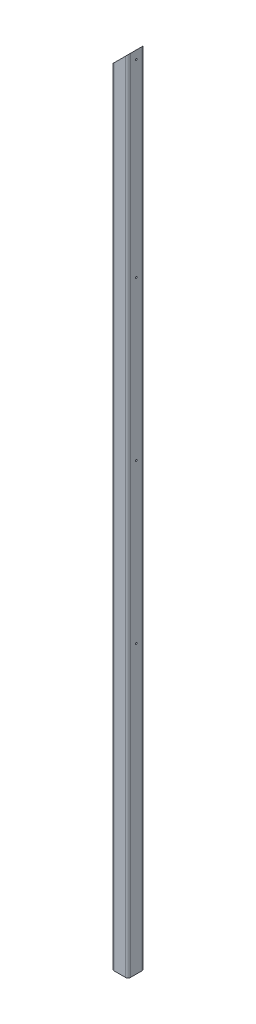
ISO-10303-21;
HEADER;
FILE_DESCRIPTION(('STEP AP214'),'2;1');
FILE_NAME('part.step','',(''),(''),'','','');
FILE_SCHEMA(('AUTOMOTIVE_DESIGN { 1 0 10303 214 1 1 1 1 }'));
ENDSEC;
DATA;
#1=APPLICATION_CONTEXT('core data for automotive mechanical design processes');
#2=APPLICATION_PROTOCOL_DEFINITION('international standard','automotive_design',2000,#1);
#3=PRODUCT_CONTEXT('',#1,'mechanical');
#4=PRODUCT('Part','Part','',(#3));
#5=PRODUCT_RELATED_PRODUCT_CATEGORY('part','',(#4));
#6=PRODUCT_DEFINITION_FORMATION('','',#4);
#7=PRODUCT_DEFINITION_CONTEXT('part definition',#1,'design');
#8=PRODUCT_DEFINITION('design','',#6,#7);
#9=PRODUCT_DEFINITION_SHAPE('','',#8);
#10=(LENGTH_UNIT() NAMED_UNIT(*) SI_UNIT(.MILLI.,.METRE.));
#11=(NAMED_UNIT(*) PLANE_ANGLE_UNIT() SI_UNIT($,.RADIAN.));
#12=(NAMED_UNIT(*) SI_UNIT($,.STERADIAN.) SOLID_ANGLE_UNIT());
#13=UNCERTAINTY_MEASURE_WITH_UNIT(LENGTH_MEASURE(1.E-05),#10,'distance_accuracy_value','');
#14=(GEOMETRIC_REPRESENTATION_CONTEXT(3) GLOBAL_UNCERTAINTY_ASSIGNED_CONTEXT((#13)) GLOBAL_UNIT_ASSIGNED_CONTEXT((#10,
#11,#12)) REPRESENTATION_CONTEXT('',''));
#15=CARTESIAN_POINT('',(0.,0.,0.));
#16=DIRECTION('',(0.,0.,1.));
#17=DIRECTION('',(1.,0.,0.));
#18=AXIS2_PLACEMENT_3D('',#15,#16,#17);
#19=CARTESIAN_POINT('',(-13.6,1920.,13.6));
#20=DIRECTION('',(0.,-1.,0.));
#21=DIRECTION('',(0.,0.,-1.));
#22=AXIS2_PLACEMENT_3D('',#19,#20,#21);
#23=CYLINDRICAL_SURFACE('',#22,6.4);
#24=CARTESIAN_POINT('',(-13.6,1886.4,13.6));
#25=DIRECTION('',(-0.707106781186548,0.707106781186547,0.));
#26=DIRECTION('',(-0.707106781186547,-0.707106781186548,0.));
#27=AXIS2_PLACEMENT_3D('',#24,#25,#26);
#28=ELLIPSE('',#27,9.05096679918782,6.4);
#29=CARTESIAN_POINT('',(-20.,1880.,13.6));
#30=VERTEX_POINT('',#29);
#31=CARTESIAN_POINT('',(-13.5999999999999,1886.4,20.));
#32=VERTEX_POINT('',#31);
#33=EDGE_CURVE('E245',#30,#32,#28,.T.);
#34=ORIENTED_EDGE('',*,*,#33,.F.);
#35=DIRECTION('',(0.,-1.,0.));
#36=VECTOR('',#35,1.);
#37=CARTESIAN_POINT('',(-20.,1920.,13.6));
#38=LINE('',#37,#36);
#39=CARTESIAN_POINT('',(-20.,0.,13.6));
#40=VERTEX_POINT('',#39);
#41=EDGE_CURVE('E161',#30,#40,#38,.T.);
#42=ORIENTED_EDGE('',*,*,#41,.T.);
#43=CARTESIAN_POINT('',(-13.6,0.,13.6));
#44=DIRECTION('',(0.,1.,0.));
#45=DIRECTION('',(0.,0.,1.));
#46=AXIS2_PLACEMENT_3D('',#43,#44,#45);
#47=CIRCLE('',#46,6.4);
#48=CARTESIAN_POINT('',(-13.6,0.,20.));
#49=VERTEX_POINT('',#48);
#50=EDGE_CURVE('E176',#40,#49,#47,.T.);
#51=ORIENTED_EDGE('',*,*,#50,.T.);
#52=DIRECTION('',(0.,-1.,0.));
#53=VECTOR('',#52,1.);
#54=CARTESIAN_POINT('',(-13.6,1920.,20.));
#55=LINE('',#54,#53);
#56=EDGE_CURVE('E12',#32,#49,#55,.T.);
#57=ORIENTED_EDGE('',*,*,#56,.F.);
#58=EDGE_LOOP('',(#34,#42,#51,#57));
#59=FACE_BOUND('',#58,.T.);
#60=ADVANCED_FACE('F66',(#59),#23,.T.);
#61=CARTESIAN_POINT('',(-13.6,1920.,20.));
#62=DIRECTION('',(0.,0.,-1.));
#63=DIRECTION('',(-1.,0.,0.));
#64=AXIS2_PLACEMENT_3D('',#61,#62,#63);
#65=PLANE('',#64);
#66=DIRECTION('',(0.707106781186547,0.707106781186548,0.));
#67=VECTOR('',#66,1.);
#68=CARTESIAN_POINT('',(-950.,950.,20.));
#69=LINE('',#68,#67);
#70=CARTESIAN_POINT('',(13.6,1913.6,20.));
#71=VERTEX_POINT('',#70);
#72=EDGE_CURVE('E350',#32,#71,#69,.T.);
#73=ORIENTED_EDGE('',*,*,#72,.F.);
#74=ORIENTED_EDGE('',*,*,#56,.T.);
#75=DIRECTION('',(1.,0.,0.));
#76=VECTOR('',#75,1.);
#77=CARTESIAN_POINT('',(-13.6,0.,20.));
#78=LINE('',#77,#76);
#79=CARTESIAN_POINT('',(13.6,0.,20.));
#80=VERTEX_POINT('',#79);
#81=EDGE_CURVE('E274',#49,#80,#78,.T.);
#82=ORIENTED_EDGE('',*,*,#81,.T.);
#83=DIRECTION('',(0.,-1.,0.));
#84=VECTOR('',#83,1.);
#85=CARTESIAN_POINT('',(13.6,1920.,20.));
#86=LINE('',#85,#84);
#87=EDGE_CURVE('E76',#71,#80,#86,.T.);
#88=ORIENTED_EDGE('',*,*,#87,.F.);
#89=EDGE_LOOP('',(#73,#74,#82,#88));
#90=FACE_BOUND('',#89,.T.);
#91=ADVANCED_FACE('F356',(#90),#65,.F.);
#92=CARTESIAN_POINT('',(13.6,1920.,13.6));
#93=DIRECTION('',(0.,-1.,0.));
#94=DIRECTION('',(0.,0.,-1.));
#95=AXIS2_PLACEMENT_3D('',#92,#93,#94);
#96=CYLINDRICAL_SURFACE('',#95,6.4);
#97=CARTESIAN_POINT('',(13.6,1913.6,13.6));
#98=DIRECTION('',(-0.707106781186548,0.707106781186547,0.));
#99=DIRECTION('',(-0.707106781186547,-0.707106781186548,0.));
#100=AXIS2_PLACEMENT_3D('',#97,#98,#99);
#101=ELLIPSE('',#100,9.05096679918782,6.4);
#102=CARTESIAN_POINT('',(20.,1920.,13.6));
#103=VERTEX_POINT('',#102);
#104=EDGE_CURVE('E93',#71,#103,#101,.T.);
#105=ORIENTED_EDGE('',*,*,#104,.F.);
#106=ORIENTED_EDGE('',*,*,#87,.T.);
#107=CARTESIAN_POINT('',(13.6,0.,13.6));
#108=DIRECTION('',(0.,1.,0.));
#109=DIRECTION('',(0.,0.,1.));
#110=AXIS2_PLACEMENT_3D('',#107,#108,#109);
#111=CIRCLE('',#110,6.4);
#112=CARTESIAN_POINT('',(20.,0.,13.6));
#113=VERTEX_POINT('',#112);
#114=EDGE_CURVE('E278',#80,#113,#111,.T.);
#115=ORIENTED_EDGE('',*,*,#114,.T.);
#116=DIRECTION('',(0.,-1.,0.));
#117=VECTOR('',#116,1.);
#118=CARTESIAN_POINT('',(20.,1920.,13.6));
#119=LINE('',#118,#117);
#120=EDGE_CURVE('E196',#103,#113,#119,.T.);
#121=ORIENTED_EDGE('',*,*,#120,.F.);
#122=EDGE_LOOP('',(#105,#106,#115,#121));
#123=FACE_BOUND('',#122,.T.);
#124=ADVANCED_FACE('F424',(#123),#96,.T.);
#125=CARTESIAN_POINT('',(13.6,1920.,-13.6));
#126=DIRECTION('',(0.,-1.,0.));
#127=DIRECTION('',(0.,0.,-1.));
#128=AXIS2_PLACEMENT_3D('',#125,#126,#127);
#129=CYLINDRICAL_SURFACE('',#128,6.4);
#130=CARTESIAN_POINT('',(13.6,1913.6,-13.6));
#131=DIRECTION('',(-0.707106781186548,0.707106781186547,0.));
#132=DIRECTION('',(-0.707106781186547,-0.707106781186548,0.));
#133=AXIS2_PLACEMENT_3D('',#130,#131,#132);
#134=ELLIPSE('',#133,9.05096679918781,6.4);
#135=CARTESIAN_POINT('',(20.,1920.,-13.6));
#136=VERTEX_POINT('',#135);
#137=CARTESIAN_POINT('',(13.6000000000003,1913.6,-20.));
#138=VERTEX_POINT('',#137);
#139=EDGE_CURVE('E303',#136,#138,#134,.T.);
#140=ORIENTED_EDGE('',*,*,#139,.F.);
#141=DIRECTION('',(0.,-1.,0.));
#142=VECTOR('',#141,1.);
#143=CARTESIAN_POINT('',(20.,1920.,-13.6));
#144=LINE('',#143,#142);
#145=CARTESIAN_POINT('',(20.,0.,-13.6));
#146=VERTEX_POINT('',#145);
#147=EDGE_CURVE('E192',#136,#146,#144,.T.);
#148=ORIENTED_EDGE('',*,*,#147,.T.);
#149=CARTESIAN_POINT('',(13.6,0.,-13.6));
#150=DIRECTION('',(0.,1.,0.));
#151=DIRECTION('',(0.,0.,1.));
#152=AXIS2_PLACEMENT_3D('',#149,#150,#151);
#153=CIRCLE('',#152,6.4);
#154=CARTESIAN_POINT('',(13.6,0.,-20.));
#155=VERTEX_POINT('',#154);
#156=EDGE_CURVE('E284',#146,#155,#153,.T.);
#157=ORIENTED_EDGE('',*,*,#156,.T.);
#158=DIRECTION('',(0.,-1.,0.));
#159=VECTOR('',#158,1.);
#160=CARTESIAN_POINT('',(13.6,1920.,-20.));
#161=LINE('',#160,#159);
#162=EDGE_CURVE('E189',#138,#155,#161,.T.);
#163=ORIENTED_EDGE('',*,*,#162,.F.);
#164=EDGE_LOOP('',(#140,#148,#157,#163));
#165=FACE_BOUND('',#164,.T.);
#166=ADVANCED_FACE('F298',(#165),#129,.T.);
#167=CARTESIAN_POINT('',(13.6,1920.,-20.));
#168=DIRECTION('',(0.,0.,1.));
#169=DIRECTION('',(1.,0.,0.));
#170=AXIS2_PLACEMENT_3D('',#167,#168,#169);
#171=PLANE('',#170);
#172=CARTESIAN_POINT('',(0.,687.,-20.));
#173=DIRECTION('',(0.,0.,-1.));
#174=DIRECTION('',(-1.,0.,0.));
#175=AXIS2_PLACEMENT_3D('',#172,#173,#174);
#176=CIRCLE('',#175,2.);
#177=CARTESIAN_POINT('',(-2.,687.,-20.));
#178=VERTEX_POINT('',#177);
#179=EDGE_CURVE('E498',#178,#178,#176,.T.);
#180=ORIENTED_EDGE('',*,*,#179,.F.);
#181=EDGE_LOOP('',(#180));
#182=FACE_BOUND('',#181,.T.);
#183=CARTESIAN_POINT('',(0.,937.,-20.));
#184=DIRECTION('',(0.,0.,-1.));
#185=DIRECTION('',(-1.,0.,0.));
#186=AXIS2_PLACEMENT_3D('',#183,#184,#185);
#187=CIRCLE('',#186,2.);
#188=CARTESIAN_POINT('',(-1.99999999999991,937.,-20.));
#189=VERTEX_POINT('',#188);
#190=EDGE_CURVE('E505',#189,#189,#187,.T.);
#191=ORIENTED_EDGE('',*,*,#190,.F.);
#192=EDGE_LOOP('',(#191));
#193=FACE_BOUND('',#192,.T.);
#194=DIRECTION('',(0.707106781186547,0.707106781186548,0.));
#195=VECTOR('',#194,1.);
#196=CARTESIAN_POINT('',(-950.,950.,-20.));
#197=LINE('',#196,#195);
#198=CARTESIAN_POINT('',(-13.6,1886.4,-20.));
#199=VERTEX_POINT('',#198);
#200=EDGE_CURVE('E358',#199,#138,#197,.T.);
#201=ORIENTED_EDGE('',*,*,#200,.T.);
#202=ORIENTED_EDGE('',*,*,#162,.T.);
#203=DIRECTION('',(-1.,0.,0.));
#204=VECTOR('',#203,1.);
#205=CARTESIAN_POINT('',(13.6,0.,-20.));
#206=LINE('',#205,#204);
#207=CARTESIAN_POINT('',(-13.6,0.,-20.));
#208=VERTEX_POINT('',#207);
#209=EDGE_CURVE('E171',#155,#208,#206,.T.);
#210=ORIENTED_EDGE('',*,*,#209,.T.);
#211=DIRECTION('',(0.,-1.,0.));
#212=VECTOR('',#211,1.);
#213=CARTESIAN_POINT('',(-13.6,1920.,-20.));
#214=LINE('',#213,#212);
#215=EDGE_CURVE('E160',#199,#208,#214,.T.);
#216=ORIENTED_EDGE('',*,*,#215,.F.);
#217=EDGE_LOOP('',(#201,#202,#210,#216));
#218=FACE_BOUND('',#217,.T.);
#219=ADVANCED_FACE('F290',(#182,#193,#218),#171,.F.);
#220=CARTESIAN_POINT('',(-13.6,1920.,-13.6));
#221=DIRECTION('',(0.,-1.,0.));
#222=DIRECTION('',(0.,0.,-1.));
#223=AXIS2_PLACEMENT_3D('',#220,#221,#222);
#224=CYLINDRICAL_SURFACE('',#223,6.4);
#225=CARTESIAN_POINT('',(-13.6,1886.4,-13.6));
#226=DIRECTION('',(-0.707106781186548,0.707106781186547,0.));
#227=DIRECTION('',(-0.707106781186547,-0.707106781186548,0.));
#228=AXIS2_PLACEMENT_3D('',#225,#226,#227);
#229=ELLIPSE('',#228,9.05096679918782,6.4);
#230=CARTESIAN_POINT('',(-20.,1880.,-13.6));
#231=VERTEX_POINT('',#230);
#232=EDGE_CURVE('E331',#199,#231,#229,.T.);
#233=ORIENTED_EDGE('',*,*,#232,.F.);
#234=ORIENTED_EDGE('',*,*,#215,.T.);
#235=CARTESIAN_POINT('',(-13.6,0.,-13.6));
#236=DIRECTION('',(0.,1.,0.));
#237=DIRECTION('',(0.,0.,1.));
#238=AXIS2_PLACEMENT_3D('',#235,#236,#237);
#239=CIRCLE('',#238,6.4);
#240=CARTESIAN_POINT('',(-20.,0.,-13.6));
#241=VERTEX_POINT('',#240);
#242=EDGE_CURVE('E164',#208,#241,#239,.T.);
#243=ORIENTED_EDGE('',*,*,#242,.T.);
#244=DIRECTION('',(0.,-1.,0.));
#245=VECTOR('',#244,1.);
#246=CARTESIAN_POINT('',(-20.,1920.,-13.6));
#247=LINE('',#246,#245);
#248=EDGE_CURVE('E147',#231,#241,#247,.T.);
#249=ORIENTED_EDGE('',*,*,#248,.F.);
#250=EDGE_LOOP('',(#233,#234,#243,#249));
#251=FACE_BOUND('',#250,.T.);
#252=ADVANCED_FACE('F165',(#251),#224,.T.);
#253=CARTESIAN_POINT('',(13.6,1920.,13.6));
#254=DIRECTION('',(0.,-1.,0.));
#255=DIRECTION('',(0.,0.,-1.));
#256=AXIS2_PLACEMENT_3D('',#253,#254,#255);
#257=CYLINDRICAL_SURFACE('',#256,3.2);
#258=DIRECTION('',(0.,-1.,0.));
#259=VECTOR('',#258,1.);
#260=CARTESIAN_POINT('',(13.6,1920.,16.8));
#261=LINE('',#260,#259);
#262=CARTESIAN_POINT('',(13.6,1913.6,16.8));
#263=VERTEX_POINT('',#262);
#264=CARTESIAN_POINT('',(13.6,0.,16.8));
#265=VERTEX_POINT('',#264);
#266=EDGE_CURVE('E70',#263,#265,#261,.T.);
#267=ORIENTED_EDGE('',*,*,#266,.F.);
#268=CARTESIAN_POINT('',(13.6,1913.6,13.6));
#269=DIRECTION('',(-0.707106781186548,0.707106781186547,0.));
#270=DIRECTION('',(-0.707106781186547,-0.707106781186548,0.));
#271=AXIS2_PLACEMENT_3D('',#268,#269,#270);
#272=ELLIPSE('',#271,4.52548339959391,3.2);
#273=CARTESIAN_POINT('',(16.8,1916.8,13.6));
#274=VERTEX_POINT('',#273);
#275=EDGE_CURVE('E327',#263,#274,#272,.T.);
#276=ORIENTED_EDGE('',*,*,#275,.T.);
#277=DIRECTION('',(0.,-1.,0.));
#278=VECTOR('',#277,1.);
#279=CARTESIAN_POINT('',(16.8,1920.,13.6));
#280=LINE('',#279,#278);
#281=CARTESIAN_POINT('',(16.8,0.,13.6));
#282=VERTEX_POINT('',#281);
#283=EDGE_CURVE('E181',#274,#282,#280,.T.);
#284=ORIENTED_EDGE('',*,*,#283,.T.);
#285=CARTESIAN_POINT('',(13.6,0.,13.6));
#286=DIRECTION('',(0.,1.,0.));
#287=DIRECTION('',(0.,0.,1.));
#288=AXIS2_PLACEMENT_3D('',#285,#286,#287);
#289=CIRCLE('',#288,3.2);
#290=EDGE_CURVE('E239',#265,#282,#289,.T.);
#291=ORIENTED_EDGE('',*,*,#290,.F.);
#292=EDGE_LOOP('',(#267,#276,#284,#291));
#293=FACE_BOUND('',#292,.T.);
#294=ADVANCED_FACE('F68',(#293),#257,.F.);
#295=CARTESIAN_POINT('',(-13.6,1920.,16.8));
#296=DIRECTION('',(0.,0.,-1.));
#297=DIRECTION('',(-1.,0.,0.));
#298=AXIS2_PLACEMENT_3D('',#295,#296,#297);
#299=PLANE('',#298);
#300=DIRECTION('',(0.,-1.,0.));
#301=VECTOR('',#300,1.);
#302=CARTESIAN_POINT('',(-13.6,1920.,16.8));
#303=LINE('',#302,#301);
#304=CARTESIAN_POINT('',(-13.6,1886.4,16.8));
#305=VERTEX_POINT('',#304);
#306=CARTESIAN_POINT('',(-13.6,0.,16.8));
#307=VERTEX_POINT('',#306);
#308=EDGE_CURVE('E218',#305,#307,#303,.T.);
#309=ORIENTED_EDGE('',*,*,#308,.F.);
#310=DIRECTION('',(0.707106781186547,0.707106781186548,0.));
#311=VECTOR('',#310,1.);
#312=CARTESIAN_POINT('',(3.19999999999985,1903.2,16.8));
#313=LINE('',#312,#311);
#314=EDGE_CURVE('E235',#305,#263,#313,.T.);
#315=ORIENTED_EDGE('',*,*,#314,.T.);
#316=ORIENTED_EDGE('',*,*,#266,.T.);
#317=DIRECTION('',(1.,0.,0.));
#318=VECTOR('',#317,1.);
#319=CARTESIAN_POINT('',(-13.6,0.,16.8));
#320=LINE('',#319,#318);
#321=EDGE_CURVE('E232',#307,#265,#320,.T.);
#322=ORIENTED_EDGE('',*,*,#321,.F.);
#323=EDGE_LOOP('',(#309,#315,#316,#322));
#324=FACE_BOUND('',#323,.T.);
#325=ADVANCED_FACE('F230',(#324),#299,.T.);
#326=CARTESIAN_POINT('',(-13.6,1920.,13.6));
#327=DIRECTION('',(0.,-1.,0.));
#328=DIRECTION('',(0.,0.,-1.));
#329=AXIS2_PLACEMENT_3D('',#326,#327,#328);
#330=CYLINDRICAL_SURFACE('',#329,3.2);
#331=DIRECTION('',(0.,-1.,0.));
#332=VECTOR('',#331,1.);
#333=CARTESIAN_POINT('',(-16.8,1920.,13.6));
#334=LINE('',#333,#332);
#335=CARTESIAN_POINT('',(-16.8,1883.2,13.6));
#336=VERTEX_POINT('',#335);
#337=CARTESIAN_POINT('',(-16.8,0.,13.6));
#338=VERTEX_POINT('',#337);
#339=EDGE_CURVE('E216',#336,#338,#334,.T.);
#340=ORIENTED_EDGE('',*,*,#339,.F.);
#341=CARTESIAN_POINT('',(-13.6,1886.4,13.6));
#342=DIRECTION('',(-0.707106781186548,0.707106781186547,0.));
#343=DIRECTION('',(-0.707106781186547,-0.707106781186548,0.));
#344=AXIS2_PLACEMENT_3D('',#341,#342,#343);
#345=ELLIPSE('',#344,4.5254833995939,3.2);
#346=EDGE_CURVE('E336',#336,#305,#345,.T.);
#347=ORIENTED_EDGE('',*,*,#346,.T.);
#348=ORIENTED_EDGE('',*,*,#308,.T.);
#349=CARTESIAN_POINT('',(-13.6,0.,13.6));
#350=DIRECTION('',(0.,1.,0.));
#351=DIRECTION('',(0.,0.,1.));
#352=AXIS2_PLACEMENT_3D('',#349,#350,#351);
#353=CIRCLE('',#352,3.2);
#354=EDGE_CURVE('E248',#338,#307,#353,.T.);
#355=ORIENTED_EDGE('',*,*,#354,.F.);
#356=EDGE_LOOP('',(#340,#347,#348,#355));
#357=FACE_BOUND('',#356,.T.);
#358=ADVANCED_FACE('F392',(#357),#330,.F.);
#359=CARTESIAN_POINT('',(-16.8,1920.,13.6));
#360=DIRECTION('',(1.,0.,0.));
#361=DIRECTION('',(0.,0.,-1.));
#362=AXIS2_PLACEMENT_3D('',#359,#360,#361);
#363=PLANE('',#362);
#364=DIRECTION('',(0.,-1.,0.));
#365=VECTOR('',#364,1.);
#366=CARTESIAN_POINT('',(-16.8,1920.,-13.6));
#367=LINE('',#366,#365);
#368=CARTESIAN_POINT('',(-16.8,1883.2,-13.6));
#369=VERTEX_POINT('',#368);
#370=CARTESIAN_POINT('',(-16.8,0.,-13.6));
#371=VERTEX_POINT('',#370);
#372=EDGE_CURVE('E213',#369,#371,#367,.T.);
#373=ORIENTED_EDGE('',*,*,#372,.F.);
#374=DIRECTION('',(0.,0.,1.));
#375=VECTOR('',#374,1.);
#376=CARTESIAN_POINT('',(-16.8,1883.2,13.6));
#377=LINE('',#376,#375);
#378=EDGE_CURVE('E387',#369,#336,#377,.T.);
#379=ORIENTED_EDGE('',*,*,#378,.T.);
#380=ORIENTED_EDGE('',*,*,#339,.T.);
#381=DIRECTION('',(0.,0.,1.));
#382=VECTOR('',#381,1.);
#383=CARTESIAN_POINT('',(-16.8,0.,13.6));
#384=LINE('',#383,#382);
#385=EDGE_CURVE('E252',#371,#338,#384,.T.);
#386=ORIENTED_EDGE('',*,*,#385,.F.);
#387=EDGE_LOOP('',(#373,#379,#380,#386));
#388=FACE_BOUND('',#387,.T.);
#389=ADVANCED_FACE('F395',(#388),#363,.T.);
#390=CARTESIAN_POINT('',(-13.6,1920.,-13.6));
#391=DIRECTION('',(0.,-1.,0.));
#392=DIRECTION('',(0.,0.,-1.));
#393=AXIS2_PLACEMENT_3D('',#390,#391,#392);
#394=CYLINDRICAL_SURFACE('',#393,3.2);
#395=DIRECTION('',(0.,-1.,0.));
#396=VECTOR('',#395,1.);
#397=CARTESIAN_POINT('',(-13.6,1920.,-16.8));
#398=LINE('',#397,#396);
#399=CARTESIAN_POINT('',(-13.6,1886.4,-16.8));
#400=VERTEX_POINT('',#399);
#401=CARTESIAN_POINT('',(-13.6,0.,-16.8));
#402=VERTEX_POINT('',#401);
#403=EDGE_CURVE('E210',#400,#402,#398,.T.);
#404=ORIENTED_EDGE('',*,*,#403,.F.);
#405=CARTESIAN_POINT('',(-13.6,1886.4,-13.6));
#406=DIRECTION('',(-0.707106781186548,0.707106781186547,0.));
#407=DIRECTION('',(-0.707106781186547,-0.707106781186548,0.));
#408=AXIS2_PLACEMENT_3D('',#405,#406,#407);
#409=ELLIPSE('',#408,4.5254833995939,3.2);
#410=EDGE_CURVE('E383',#400,#369,#409,.T.);
#411=ORIENTED_EDGE('',*,*,#410,.T.);
#412=ORIENTED_EDGE('',*,*,#372,.T.);
#413=CARTESIAN_POINT('',(-13.6,0.,-13.6));
#414=DIRECTION('',(0.,1.,0.));
#415=DIRECTION('',(0.,0.,1.));
#416=AXIS2_PLACEMENT_3D('',#413,#414,#415);
#417=CIRCLE('',#416,3.2);
#418=EDGE_CURVE('E257',#402,#371,#417,.T.);
#419=ORIENTED_EDGE('',*,*,#418,.F.);
#420=EDGE_LOOP('',(#404,#411,#412,#419));
#421=FACE_BOUND('',#420,.T.);
#422=ADVANCED_FACE('F400',(#421),#394,.F.);
#423=CARTESIAN_POINT('',(13.6,1920.,-16.8));
#424=DIRECTION('',(0.,0.,1.));
#425=DIRECTION('',(1.,0.,0.));
#426=AXIS2_PLACEMENT_3D('',#423,#424,#425);
#427=PLANE('',#426);
#428=DIRECTION('',(0.,-1.,0.));
#429=VECTOR('',#428,1.);
#430=CARTESIAN_POINT('',(13.6,1920.,-16.8));
#431=LINE('',#430,#429);
#432=CARTESIAN_POINT('',(13.6,1913.6,-16.8));
#433=VERTEX_POINT('',#432);
#434=CARTESIAN_POINT('',(13.6,0.,-16.8));
#435=VERTEX_POINT('',#434);
#436=EDGE_CURVE('E207',#433,#435,#431,.T.);
#437=ORIENTED_EDGE('',*,*,#436,.F.);
#438=DIRECTION('',(-0.707106781186547,-0.707106781186548,0.));
#439=VECTOR('',#438,1.);
#440=CARTESIAN_POINT('',(16.7999999999999,1916.8,-16.8));
#441=LINE('',#440,#439);
#442=EDGE_CURVE('E379',#433,#400,#441,.T.);
#443=ORIENTED_EDGE('',*,*,#442,.T.);
#444=ORIENTED_EDGE('',*,*,#403,.T.);
#445=DIRECTION('',(-1.,0.,0.));
#446=VECTOR('',#445,1.);
#447=CARTESIAN_POINT('',(13.6,0.,-16.8));
#448=LINE('',#447,#446);
#449=EDGE_CURVE('E261',#435,#402,#448,.T.);
#450=ORIENTED_EDGE('',*,*,#449,.F.);
#451=EDGE_LOOP('',(#437,#443,#444,#450));
#452=FACE_BOUND('',#451,.T.);
#453=ADVANCED_FACE('F403',(#452),#427,.T.);
#454=CARTESIAN_POINT('',(13.6,1920.,-13.6));
#455=DIRECTION('',(0.,-1.,0.));
#456=DIRECTION('',(0.,0.,-1.));
#457=AXIS2_PLACEMENT_3D('',#454,#455,#456);
#458=CYLINDRICAL_SURFACE('',#457,3.2);
#459=DIRECTION('',(0.,-1.,0.));
#460=VECTOR('',#459,1.);
#461=CARTESIAN_POINT('',(16.8,1920.,-13.6));
#462=LINE('',#461,#460);
#463=CARTESIAN_POINT('',(16.8,1916.8,-13.6));
#464=VERTEX_POINT('',#463);
#465=CARTESIAN_POINT('',(16.8,0.,-13.6));
#466=VERTEX_POINT('',#465);
#467=EDGE_CURVE('E204',#464,#466,#462,.T.);
#468=ORIENTED_EDGE('',*,*,#467,.F.);
#469=CARTESIAN_POINT('',(13.6,1913.6,-13.6));
#470=DIRECTION('',(-0.707106781186548,0.707106781186547,0.));
#471=DIRECTION('',(-0.707106781186547,-0.707106781186548,0.));
#472=AXIS2_PLACEMENT_3D('',#469,#470,#471);
#473=ELLIPSE('',#472,4.5254833995939,3.2);
#474=EDGE_CURVE('E84',#464,#433,#473,.T.);
#475=ORIENTED_EDGE('',*,*,#474,.T.);
#476=ORIENTED_EDGE('',*,*,#436,.T.);
#477=CARTESIAN_POINT('',(13.6,0.,-13.6));
#478=DIRECTION('',(0.,1.,0.));
#479=DIRECTION('',(0.,0.,1.));
#480=AXIS2_PLACEMENT_3D('',#477,#478,#479);
#481=CIRCLE('',#480,3.2);
#482=EDGE_CURVE('E265',#466,#435,#481,.T.);
#483=ORIENTED_EDGE('',*,*,#482,.F.);
#484=EDGE_LOOP('',(#468,#475,#476,#483));
#485=FACE_BOUND('',#484,.T.);
#486=ADVANCED_FACE('F408',(#485),#458,.F.);
#487=CARTESIAN_POINT('',(16.8,1920.,-13.6));
#488=DIRECTION('',(-1.,0.,0.));
#489=DIRECTION('',(0.,0.,1.));
#490=AXIS2_PLACEMENT_3D('',#487,#488,#489);
#491=PLANE('',#490);
#492=ORIENTED_EDGE('',*,*,#283,.F.);
#493=DIRECTION('',(0.,0.,-1.));
#494=VECTOR('',#493,1.);
#495=CARTESIAN_POINT('',(16.8,1916.8,-13.6));
#496=LINE('',#495,#494);
#497=EDGE_CURVE('E329',#274,#464,#496,.T.);
#498=ORIENTED_EDGE('',*,*,#497,.T.);
#499=ORIENTED_EDGE('',*,*,#467,.T.);
#500=DIRECTION('',(0.,0.,-1.));
#501=VECTOR('',#500,1.);
#502=CARTESIAN_POINT('',(16.8,0.,-13.6));
#503=LINE('',#502,#501);
#504=EDGE_CURVE('E269',#282,#466,#503,.T.);
#505=ORIENTED_EDGE('',*,*,#504,.F.);
#506=EDGE_LOOP('',(#492,#498,#499,#505));
#507=FACE_BOUND('',#506,.T.);
#508=ADVANCED_FACE('F410',(#507),#491,.T.);
#509=CARTESIAN_POINT('',(-20.,1920.,13.6));
#510=DIRECTION('',(1.,0.,0.));
#511=DIRECTION('',(0.,0.,-1.));
#512=AXIS2_PLACEMENT_3D('',#509,#510,#511);
#513=PLANE('',#512);
#514=DIRECTION('',(0.,0.,-1.));
#515=VECTOR('',#514,1.);
#516=CARTESIAN_POINT('',(-20.,1880.,20.));
#517=LINE('',#516,#515);
#518=EDGE_CURVE('E156',#30,#231,#517,.T.);
#519=ORIENTED_EDGE('',*,*,#518,.T.);
#520=ORIENTED_EDGE('',*,*,#248,.T.);
#521=DIRECTION('',(0.,0.,1.));
#522=VECTOR('',#521,1.);
#523=CARTESIAN_POINT('',(-20.,0.,13.6));
#524=LINE('',#523,#522);
#525=EDGE_CURVE('E152',#241,#40,#524,.T.);
#526=ORIENTED_EDGE('',*,*,#525,.T.);
#527=ORIENTED_EDGE('',*,*,#41,.F.);
#528=EDGE_LOOP('',(#519,#520,#526,#527));
#529=FACE_BOUND('',#528,.T.);
#530=ADVANCED_FACE('F149',(#529),#513,.F.);
#531=CARTESIAN_POINT('',(20.,1920.,-13.6));
#532=DIRECTION('',(-1.,0.,0.));
#533=DIRECTION('',(0.,0.,1.));
#534=AXIS2_PLACEMENT_3D('',#531,#532,#533);
#535=PLANE('',#534);
#536=CARTESIAN_POINT('',(20.,1900.,0.));
#537=DIRECTION('',(1.,0.,0.));
#538=DIRECTION('',(0.,0.,-1.));
#539=AXIS2_PLACEMENT_3D('',#536,#537,#538);
#540=CIRCLE('',#539,2.);
#541=CARTESIAN_POINT('',(20.,1900.,-2.00000000000001));
#542=VERTEX_POINT('',#541);
#543=EDGE_CURVE('E369',#542,#542,#540,.T.);
#544=ORIENTED_EDGE('',*,*,#543,.F.);
#545=EDGE_LOOP('',(#544));
#546=FACE_BOUND('',#545,.T.);
#547=CARTESIAN_POINT('',(20.,1447.,0.));
#548=DIRECTION('',(1.,0.,0.));
#549=DIRECTION('',(0.,0.,-1.));
#550=AXIS2_PLACEMENT_3D('',#547,#548,#549);
#551=CIRCLE('',#550,2.);
#552=CARTESIAN_POINT('',(20.,1447.,-2.00000000000007));
#553=VERTEX_POINT('',#552);
#554=EDGE_CURVE('E522',#553,#553,#551,.T.);
#555=ORIENTED_EDGE('',*,*,#554,.F.);
#556=EDGE_LOOP('',(#555));
#557=FACE_BOUND('',#556,.T.);
#558=CARTESIAN_POINT('',(20.,1067.,-1.10920259905105E-13));
#559=DIRECTION('',(1.,0.,0.));
#560=DIRECTION('',(0.,0.,-1.));
#561=AXIS2_PLACEMENT_3D('',#558,#559,#560);
#562=CIRCLE('',#561,2.);
#563=CARTESIAN_POINT('',(20.,1067.,-2.00000000000011));
#564=VERTEX_POINT('',#563);
#565=EDGE_CURVE('E530',#564,#564,#562,.T.);
#566=ORIENTED_EDGE('',*,*,#565,.F.);
#567=EDGE_LOOP('',(#566));
#568=FACE_BOUND('',#567,.T.);
#569=CARTESIAN_POINT('',(20.,687.,-1.57757793756479E-13));
#570=DIRECTION('',(1.,0.,0.));
#571=DIRECTION('',(0.,0.,-1.));
#572=AXIS2_PLACEMENT_3D('',#569,#570,#571);
#573=CIRCLE('',#572,2.);
#574=CARTESIAN_POINT('',(20.,687.,-2.00000000000016));
#575=VERTEX_POINT('',#574);
#576=EDGE_CURVE('E497',#575,#575,#573,.T.);
#577=ORIENTED_EDGE('',*,*,#576,.F.);
#578=EDGE_LOOP('',(#577));
#579=FACE_BOUND('',#578,.T.);
#580=DIRECTION('',(0.,0.,-1.));
#581=VECTOR('',#580,1.);
#582=CARTESIAN_POINT('',(20.,0.,-13.6));
#583=LINE('',#582,#581);
#584=EDGE_CURVE('E281',#113,#146,#583,.T.);
#585=ORIENTED_EDGE('',*,*,#584,.T.);
#586=ORIENTED_EDGE('',*,*,#147,.F.);
#587=DIRECTION('',(0.,0.,-1.));
#588=VECTOR('',#587,1.);
#589=CARTESIAN_POINT('',(20.,1920.,-13.6));
#590=LINE('',#589,#588);
#591=EDGE_CURVE('E178',#103,#136,#590,.T.);
#592=ORIENTED_EDGE('',*,*,#591,.F.);
#593=ORIENTED_EDGE('',*,*,#120,.T.);
#594=EDGE_LOOP('',(#585,#586,#592,#593));
#595=FACE_BOUND('',#594,.T.);
#596=ADVANCED_FACE('F306',(#546,#557,#568,#579,#595),#535,.F.);
#597=CARTESIAN_POINT('',(-13.6,0.,13.6));
#598=DIRECTION('',(0.,1.,0.));
#599=DIRECTION('',(0.,0.,1.));
#600=AXIS2_PLACEMENT_3D('',#597,#598,#599);
#601=PLANE('',#600);
#602=ORIENTED_EDGE('',*,*,#290,.T.);
#603=ORIENTED_EDGE('',*,*,#504,.T.);
#604=ORIENTED_EDGE('',*,*,#482,.T.);
#605=ORIENTED_EDGE('',*,*,#449,.T.);
#606=ORIENTED_EDGE('',*,*,#418,.T.);
#607=ORIENTED_EDGE('',*,*,#385,.T.);
#608=ORIENTED_EDGE('',*,*,#354,.T.);
#609=ORIENTED_EDGE('',*,*,#321,.T.);
#610=EDGE_LOOP('',(#602,#603,#604,#605,#606,#607,#608,#609));
#611=FACE_BOUND('',#610,.T.);
#612=ORIENTED_EDGE('',*,*,#50,.F.);
#613=ORIENTED_EDGE('',*,*,#525,.F.);
#614=ORIENTED_EDGE('',*,*,#242,.F.);
#615=ORIENTED_EDGE('',*,*,#209,.F.);
#616=ORIENTED_EDGE('',*,*,#156,.F.);
#617=ORIENTED_EDGE('',*,*,#584,.F.);
#618=ORIENTED_EDGE('',*,*,#114,.F.);
#619=ORIENTED_EDGE('',*,*,#81,.F.);
#620=EDGE_LOOP('',(#612,#613,#614,#615,#616,#617,#618,#619));
#621=FACE_BOUND('',#620,.T.);
#622=ADVANCED_FACE('F173',(#611,#621),#601,.F.);
#623=CARTESIAN_POINT('',(-950.,950.,20.));
#624=DIRECTION('',(-0.707106781186548,0.707106781186547,0.));
#625=DIRECTION('',(-0.707106781186547,-0.707106781186548,0.));
#626=AXIS2_PLACEMENT_3D('',#623,#624,#625);
#627=PLANE('',#626);
#628=ORIENTED_EDGE('',*,*,#314,.F.);
#629=ORIENTED_EDGE('',*,*,#346,.F.);
#630=ORIENTED_EDGE('',*,*,#378,.F.);
#631=ORIENTED_EDGE('',*,*,#410,.F.);
#632=ORIENTED_EDGE('',*,*,#442,.F.);
#633=ORIENTED_EDGE('',*,*,#474,.F.);
#634=ORIENTED_EDGE('',*,*,#497,.F.);
#635=ORIENTED_EDGE('',*,*,#275,.F.);
#636=EDGE_LOOP('',(#628,#629,#630,#631,#632,#633,#634,#635));
#637=FACE_BOUND('',#636,.T.);
#638=ORIENTED_EDGE('',*,*,#33,.T.);
#639=ORIENTED_EDGE('',*,*,#72,.T.);
#640=ORIENTED_EDGE('',*,*,#104,.T.);
#641=ORIENTED_EDGE('',*,*,#591,.T.);
#642=ORIENTED_EDGE('',*,*,#139,.T.);
#643=ORIENTED_EDGE('',*,*,#200,.F.);
#644=ORIENTED_EDGE('',*,*,#232,.T.);
#645=ORIENTED_EDGE('',*,*,#518,.F.);
#646=EDGE_LOOP('',(#638,#639,#640,#641,#642,#643,#644,#645));
#647=FACE_BOUND('',#646,.T.);
#648=ADVANCED_FACE('F328',(#637,#647),#627,.T.);
#649=CARTESIAN_POINT('',(17.,687.,-1.56992474575901E-13));
#650=DIRECTION('',(1.,0.,0.));
#651=DIRECTION('',(0.,0.,-1.));
#652=AXIS2_PLACEMENT_3D('',#649,#650,#651);
#653=CYLINDRICAL_SURFACE('',#652,2.);
#654=CARTESIAN_POINT('',(17.,687.,-1.56992474575901E-13));
#655=DIRECTION('',(1.,0.,0.));
#656=DIRECTION('',(0.,0.,-1.));
#657=AXIS2_PLACEMENT_3D('',#654,#655,#656);
#658=CIRCLE('',#657,2.);
#659=CARTESIAN_POINT('',(17.,687.,-2.00000000000016));
#660=VERTEX_POINT('',#659);
#661=EDGE_CURVE('E503',#660,#660,#658,.T.);
#662=ORIENTED_EDGE('',*,*,#661,.F.);
#663=EDGE_LOOP('',(#662));
#664=FACE_BOUND('',#663,.T.);
#665=ORIENTED_EDGE('',*,*,#576,.T.);
#666=EDGE_LOOP('',(#665));
#667=FACE_BOUND('',#666,.T.);
#668=ADVANCED_FACE('F444',(#664,#667),#653,.F.);
#669=CARTESIAN_POINT('',(17.,687.,-1.56992474575901E-13));
#670=DIRECTION('',(1.,0.,0.));
#671=DIRECTION('',(0.,0.,-1.));
#672=AXIS2_PLACEMENT_3D('',#669,#670,#671);
#673=PLANE('',#672);
#674=ORIENTED_EDGE('',*,*,#661,.T.);
#675=EDGE_LOOP('',(#674));
#676=FACE_BOUND('',#675,.T.);
#677=ADVANCED_FACE('F447',(#676),#673,.T.);
#678=CARTESIAN_POINT('',(17.,1067.,-1.10154940724527E-13));
#679=DIRECTION('',(1.,0.,0.));
#680=DIRECTION('',(0.,0.,-1.));
#681=AXIS2_PLACEMENT_3D('',#678,#679,#680);
#682=CYLINDRICAL_SURFACE('',#681,2.);
#683=CARTESIAN_POINT('',(17.,1067.,-1.10154940724527E-13));
#684=DIRECTION('',(1.,0.,0.));
#685=DIRECTION('',(0.,0.,-1.));
#686=AXIS2_PLACEMENT_3D('',#683,#684,#685);
#687=CIRCLE('',#686,2.);
#688=CARTESIAN_POINT('',(17.,1067.,-2.00000000000011));
#689=VERTEX_POINT('',#688);
#690=EDGE_CURVE('E526',#689,#689,#687,.T.);
#691=ORIENTED_EDGE('',*,*,#690,.F.);
#692=EDGE_LOOP('',(#691));
#693=FACE_BOUND('',#692,.T.);
#694=ORIENTED_EDGE('',*,*,#565,.T.);
#695=EDGE_LOOP('',(#694));
#696=FACE_BOUND('',#695,.T.);
#697=ADVANCED_FACE('F451',(#693,#696),#682,.F.);
#698=CARTESIAN_POINT('',(17.,1067.,-1.10154940724527E-13));
#699=DIRECTION('',(1.,0.,0.));
#700=DIRECTION('',(0.,0.,-1.));
#701=AXIS2_PLACEMENT_3D('',#698,#699,#700);
#702=PLANE('',#701);
#703=ORIENTED_EDGE('',*,*,#690,.T.);
#704=EDGE_LOOP('',(#703));
#705=FACE_BOUND('',#704,.T.);
#706=ADVANCED_FACE('F455',(#705),#702,.T.);
#707=CARTESIAN_POINT('',(17.,1447.,0.));
#708=DIRECTION('',(1.,0.,0.));
#709=DIRECTION('',(0.,0.,-1.));
#710=AXIS2_PLACEMENT_3D('',#707,#708,#709);
#711=CYLINDRICAL_SURFACE('',#710,2.);
#712=CARTESIAN_POINT('',(17.,1447.,0.));
#713=DIRECTION('',(1.,0.,0.));
#714=DIRECTION('',(0.,0.,-1.));
#715=AXIS2_PLACEMENT_3D('',#712,#713,#714);
#716=CIRCLE('',#715,2.);
#717=CARTESIAN_POINT('',(17.,1447.,-2.00000000000006));
#718=VERTEX_POINT('',#717);
#719=EDGE_CURVE('E518',#718,#718,#716,.T.);
#720=ORIENTED_EDGE('',*,*,#719,.F.);
#721=EDGE_LOOP('',(#720));
#722=FACE_BOUND('',#721,.T.);
#723=ORIENTED_EDGE('',*,*,#554,.T.);
#724=EDGE_LOOP('',(#723));
#725=FACE_BOUND('',#724,.T.);
#726=ADVANCED_FACE('F459',(#722,#725),#711,.F.);
#727=CARTESIAN_POINT('',(17.,1447.,0.));
#728=DIRECTION('',(1.,0.,0.));
#729=DIRECTION('',(0.,0.,-1.));
#730=AXIS2_PLACEMENT_3D('',#727,#728,#729);
#731=PLANE('',#730);
#732=ORIENTED_EDGE('',*,*,#719,.T.);
#733=EDGE_LOOP('',(#732));
#734=FACE_BOUND('',#733,.T.);
#735=ADVANCED_FACE('F463',(#734),#731,.T.);
#736=CARTESIAN_POINT('',(17.,1900.,0.));
#737=DIRECTION('',(1.,0.,0.));
#738=DIRECTION('',(0.,0.,-1.));
#739=AXIS2_PLACEMENT_3D('',#736,#737,#738);
#740=CYLINDRICAL_SURFACE('',#739,2.);
#741=CARTESIAN_POINT('',(17.,1900.,0.));
#742=DIRECTION('',(1.,0.,0.));
#743=DIRECTION('',(0.,0.,-1.));
#744=AXIS2_PLACEMENT_3D('',#741,#742,#743);
#745=CIRCLE('',#744,2.);
#746=CARTESIAN_POINT('',(17.,1900.,-2.00000000000001));
#747=VERTEX_POINT('',#746);
#748=EDGE_CURVE('E365',#747,#747,#745,.T.);
#749=ORIENTED_EDGE('',*,*,#748,.F.);
#750=EDGE_LOOP('',(#749));
#751=FACE_BOUND('',#750,.T.);
#752=ORIENTED_EDGE('',*,*,#543,.T.);
#753=EDGE_LOOP('',(#752));
#754=FACE_BOUND('',#753,.T.);
#755=ADVANCED_FACE('F467',(#751,#754),#740,.F.);
#756=CARTESIAN_POINT('',(17.,1900.,0.));
#757=DIRECTION('',(1.,0.,0.));
#758=DIRECTION('',(0.,0.,-1.));
#759=AXIS2_PLACEMENT_3D('',#756,#757,#758);
#760=PLANE('',#759);
#761=ORIENTED_EDGE('',*,*,#748,.T.);
#762=EDGE_LOOP('',(#761));
#763=FACE_BOUND('',#762,.T.);
#764=ADVANCED_FACE('F471',(#763),#760,.T.);
#765=CARTESIAN_POINT('',(0.,937.,-17.));
#766=DIRECTION('',(0.,0.,-1.));
#767=DIRECTION('',(-1.,0.,0.));
#768=AXIS2_PLACEMENT_3D('',#765,#766,#767);
#769=CYLINDRICAL_SURFACE('',#768,2.);
#770=CARTESIAN_POINT('',(0.,937.,-17.));
#771=DIRECTION('',(0.,0.,-1.));
#772=DIRECTION('',(-1.,0.,0.));
#773=AXIS2_PLACEMENT_3D('',#770,#771,#772);
#774=CIRCLE('',#773,2.);
#775=CARTESIAN_POINT('',(-1.99999999999991,937.,-17.));
#776=VERTEX_POINT('',#775);
#777=EDGE_CURVE('E511',#776,#776,#774,.T.);
#778=ORIENTED_EDGE('',*,*,#777,.F.);
#779=EDGE_LOOP('',(#778));
#780=FACE_BOUND('',#779,.T.);
#781=ORIENTED_EDGE('',*,*,#190,.T.);
#782=EDGE_LOOP('',(#781));
#783=FACE_BOUND('',#782,.T.);
#784=ADVANCED_FACE('F475',(#780,#783),#769,.F.);
#785=CARTESIAN_POINT('',(0.,937.,-17.));
#786=DIRECTION('',(0.,0.,-1.));
#787=DIRECTION('',(-1.,0.,0.));
#788=AXIS2_PLACEMENT_3D('',#785,#786,#787);
#789=PLANE('',#788);
#790=ORIENTED_EDGE('',*,*,#777,.T.);
#791=EDGE_LOOP('',(#790));
#792=FACE_BOUND('',#791,.T.);
#793=ADVANCED_FACE('F477',(#792),#789,.T.);
#794=CARTESIAN_POINT('',(0.,687.,-17.));
#795=DIRECTION('',(0.,0.,-1.));
#796=DIRECTION('',(-1.,0.,0.));
#797=AXIS2_PLACEMENT_3D('',#794,#795,#796);
#798=CYLINDRICAL_SURFACE('',#797,2.);
#799=CARTESIAN_POINT('',(0.,687.,-17.));
#800=DIRECTION('',(0.,0.,-1.));
#801=DIRECTION('',(-1.,0.,0.));
#802=AXIS2_PLACEMENT_3D('',#799,#800,#801);
#803=CIRCLE('',#802,2.);
#804=CARTESIAN_POINT('',(-2.,687.,-17.));
#805=VERTEX_POINT('',#804);
#806=EDGE_CURVE('E495',#805,#805,#803,.T.);
#807=ORIENTED_EDGE('',*,*,#806,.F.);
#808=EDGE_LOOP('',(#807));
#809=FACE_BOUND('',#808,.T.);
#810=ORIENTED_EDGE('',*,*,#179,.T.);
#811=EDGE_LOOP('',(#810));
#812=FACE_BOUND('',#811,.T.);
#813=ADVANCED_FACE('F480',(#809,#812),#798,.F.);
#814=CARTESIAN_POINT('',(0.,687.,-17.));
#815=DIRECTION('',(0.,0.,-1.));
#816=DIRECTION('',(-1.,0.,0.));
#817=AXIS2_PLACEMENT_3D('',#814,#815,#816);
#818=PLANE('',#817);
#819=ORIENTED_EDGE('',*,*,#806,.T.);
#820=EDGE_LOOP('',(#819));
#821=FACE_BOUND('',#820,.T.);
#822=ADVANCED_FACE('F487',(#821),#818,.T.);
#823=CLOSED_SHELL('',(#60,#91,#124,#166,#219,#252,#294,#325,#358,#389,#422,#453,#486,#508,#530,
#596,#622,#648,#668,#677,#697,#706,#726,#735,#755,#764,#784,#793,#813,#822));
#824=MANIFOLD_SOLID_BREP('B2',#823);
#825=ADVANCED_BREP_SHAPE_REPRESENTATION('',(#18,#824),#14);
#826=SHAPE_DEFINITION_REPRESENTATION(#9,#825);
ENDSEC;
END-ISO-10303-21;
